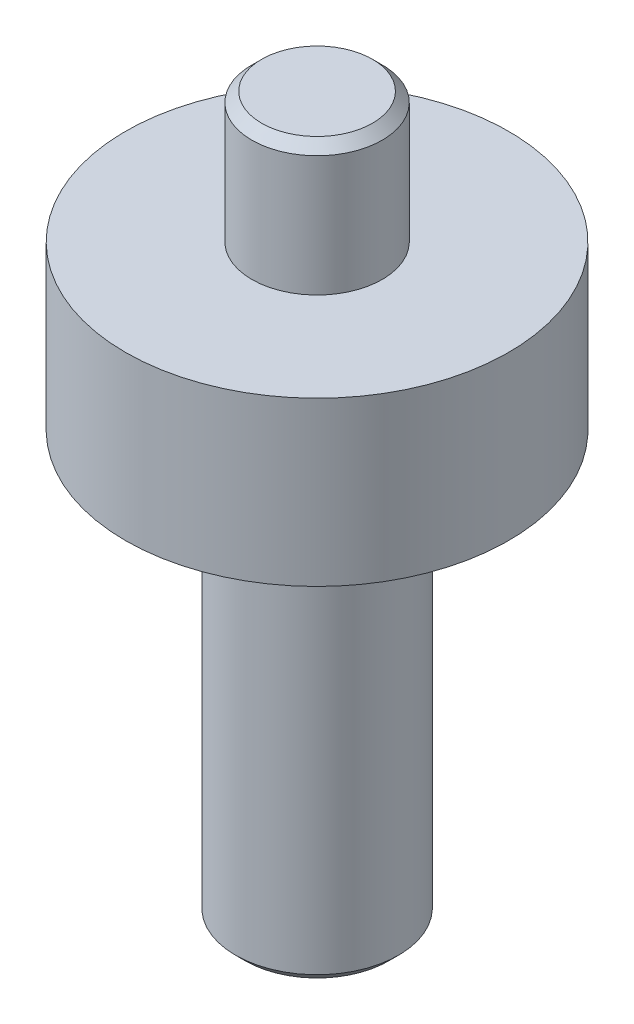
ISO-10303-21;
HEADER;
FILE_DESCRIPTION(('STEP AP214'),'2;1');
FILE_NAME('part.step','',(''),(''),'','','');
FILE_SCHEMA(('AUTOMOTIVE_DESIGN { 1 0 10303 214 1 1 1 1 }'));
ENDSEC;
DATA;
#1=APPLICATION_CONTEXT('core data for automotive mechanical design processes');
#2=APPLICATION_PROTOCOL_DEFINITION('international standard','automotive_design',2000,#1);
#3=PRODUCT_CONTEXT('',#1,'mechanical');
#4=PRODUCT('Part','Part','',(#3));
#5=PRODUCT_RELATED_PRODUCT_CATEGORY('part','',(#4));
#6=PRODUCT_DEFINITION_FORMATION('','',#4);
#7=PRODUCT_DEFINITION_CONTEXT('part definition',#1,'design');
#8=PRODUCT_DEFINITION('design','',#6,#7);
#9=PRODUCT_DEFINITION_SHAPE('','',#8);
#10=(LENGTH_UNIT() NAMED_UNIT(*) SI_UNIT(.MILLI.,.METRE.));
#11=(NAMED_UNIT(*) PLANE_ANGLE_UNIT() SI_UNIT($,.RADIAN.));
#12=(NAMED_UNIT(*) SI_UNIT($,.STERADIAN.) SOLID_ANGLE_UNIT());
#13=UNCERTAINTY_MEASURE_WITH_UNIT(LENGTH_MEASURE(1.E-05),#10,'distance_accuracy_value','');
#14=(GEOMETRIC_REPRESENTATION_CONTEXT(3) GLOBAL_UNCERTAINTY_ASSIGNED_CONTEXT((#13)) GLOBAL_UNIT_ASSIGNED_CONTEXT((#10,
#11,#12)) REPRESENTATION_CONTEXT('',''));
#15=CARTESIAN_POINT('',(0.,0.,0.));
#16=DIRECTION('',(0.,0.,1.));
#17=DIRECTION('',(1.,0.,0.));
#18=AXIS2_PLACEMENT_3D('',#15,#16,#17);
#19=CARTESIAN_POINT('',(0.,10.,0.));
#20=DIRECTION('',(0.,-1.,0.));
#21=DIRECTION('',(0.,0.,-1.));
#22=AXIS2_PLACEMENT_3D('',#19,#20,#21);
#23=CYLINDRICAL_SURFACE('',#22,11.75);
#24=CARTESIAN_POINT('',(0.,10.,0.));
#25=DIRECTION('',(0.,1.,0.));
#26=DIRECTION('',(0.,0.,1.));
#27=AXIS2_PLACEMENT_3D('',#24,#25,#26);
#28=CIRCLE('',#27,11.75);
#29=CARTESIAN_POINT('',(0.,10.,11.75));
#30=VERTEX_POINT('',#29);
#31=EDGE_CURVE('E128',#30,#30,#28,.T.);
#32=ORIENTED_EDGE('',*,*,#31,.F.);
#33=EDGE_LOOP('',(#32));
#34=FACE_BOUND('',#33,.T.);
#35=CARTESIAN_POINT('',(0.,0.,0.));
#36=DIRECTION('',(0.,1.,0.));
#37=DIRECTION('',(0.,0.,1.));
#38=AXIS2_PLACEMENT_3D('',#35,#36,#37);
#39=CIRCLE('',#38,11.75);
#40=CARTESIAN_POINT('',(0.,0.,11.75));
#41=VERTEX_POINT('',#40);
#42=EDGE_CURVE('E124',#41,#41,#39,.T.);
#43=ORIENTED_EDGE('',*,*,#42,.T.);
#44=EDGE_LOOP('',(#43));
#45=FACE_BOUND('',#44,.T.);
#46=ADVANCED_FACE('F43',(#34,#45),#23,.T.);
#47=CARTESIAN_POINT('',(0.,10.,0.));
#48=DIRECTION('',(0.,1.,0.));
#49=DIRECTION('',(0.,0.,1.));
#50=AXIS2_PLACEMENT_3D('',#47,#48,#49);
#51=PLANE('',#50);
#52=CARTESIAN_POINT('',(0.,10.,0.));
#53=DIRECTION('',(0.,1.,0.));
#54=DIRECTION('',(0.,0.,1.));
#55=AXIS2_PLACEMENT_3D('',#52,#53,#54);
#56=CIRCLE('',#55,4.);
#57=CARTESIAN_POINT('',(0.,10.,4.));
#58=VERTEX_POINT('',#57);
#59=EDGE_CURVE('E116',#58,#58,#56,.T.);
#60=ORIENTED_EDGE('',*,*,#59,.F.);
#61=EDGE_LOOP('',(#60));
#62=FACE_BOUND('',#61,.T.);
#63=ORIENTED_EDGE('',*,*,#31,.T.);
#64=EDGE_LOOP('',(#63));
#65=FACE_BOUND('',#64,.T.);
#66=ADVANCED_FACE('F188',(#62,#65),#51,.T.);
#67=CARTESIAN_POINT('',(0.,0.,0.));
#68=DIRECTION('',(0.,1.,0.));
#69=DIRECTION('',(0.,0.,1.));
#70=AXIS2_PLACEMENT_3D('',#67,#68,#69);
#71=PLANE('',#70);
#72=CARTESIAN_POINT('',(0.,0.,0.));
#73=DIRECTION('',(0.,1.,0.));
#74=DIRECTION('',(0.,0.,1.));
#75=AXIS2_PLACEMENT_3D('',#72,#73,#74);
#76=CIRCLE('',#75,6.);
#77=CARTESIAN_POINT('',(0.,0.,6.));
#78=VERTEX_POINT('',#77);
#79=EDGE_CURVE('E125',#78,#78,#76,.T.);
#80=ORIENTED_EDGE('',*,*,#79,.T.);
#81=EDGE_LOOP('',(#80));
#82=FACE_BOUND('',#81,.T.);
#83=ORIENTED_EDGE('',*,*,#42,.F.);
#84=EDGE_LOOP('',(#83));
#85=FACE_BOUND('',#84,.T.);
#86=ADVANCED_FACE('F195',(#82,#85),#71,.F.);
#87=CARTESIAN_POINT('',(0.,-4.,0.));
#88=DIRECTION('',(0.,1.,0.));
#89=DIRECTION('',(0.,0.,1.));
#90=AXIS2_PLACEMENT_3D('',#87,#88,#89);
#91=CYLINDRICAL_SURFACE('',#90,6.);
#92=CARTESIAN_POINT('',(0.,-4.,0.));
#93=DIRECTION('',(0.,1.,0.));
#94=DIRECTION('',(0.,0.,1.));
#95=AXIS2_PLACEMENT_3D('',#92,#93,#94);
#96=CIRCLE('',#95,6.);
#97=CARTESIAN_POINT('',(0.,-4.,6.));
#98=VERTEX_POINT('',#97);
#99=EDGE_CURVE('E121',#98,#98,#96,.T.);
#100=ORIENTED_EDGE('',*,*,#99,.T.);
#101=EDGE_LOOP('',(#100));
#102=FACE_BOUND('',#101,.T.);
#103=ORIENTED_EDGE('',*,*,#79,.F.);
#104=EDGE_LOOP('',(#103));
#105=FACE_BOUND('',#104,.T.);
#106=ADVANCED_FACE('F201',(#102,#105),#91,.T.);
#107=CARTESIAN_POINT('',(0.,-4.,0.));
#108=DIRECTION('',(0.,1.,0.));
#109=DIRECTION('',(0.,0.,1.));
#110=AXIS2_PLACEMENT_3D('',#107,#108,#109);
#111=PLANE('',#110);
#112=CARTESIAN_POINT('',(0.,-4.,0.));
#113=DIRECTION('',(0.,1.,0.));
#114=DIRECTION('',(0.,0.,1.));
#115=AXIS2_PLACEMENT_3D('',#112,#113,#114);
#116=CIRCLE('',#115,5.);
#117=CARTESIAN_POINT('',(0.,-4.,5.));
#118=VERTEX_POINT('',#117);
#119=EDGE_CURVE('E112',#118,#118,#116,.T.);
#120=ORIENTED_EDGE('',*,*,#119,.T.);
#121=EDGE_LOOP('',(#120));
#122=FACE_BOUND('',#121,.T.);
#123=ORIENTED_EDGE('',*,*,#99,.F.);
#124=EDGE_LOOP('',(#123));
#125=FACE_BOUND('',#124,.T.);
#126=ADVANCED_FACE('F185',(#122,#125),#111,.F.);
#127=CARTESIAN_POINT('',(0.,-26.,0.));
#128=DIRECTION('',(0.,1.,0.));
#129=DIRECTION('',(0.,0.,1.));
#130=AXIS2_PLACEMENT_3D('',#127,#128,#129);
#131=CYLINDRICAL_SURFACE('',#130,5.);
#132=CARTESIAN_POINT('',(-4.58257569495584,-22.2,-2.));
#133=CARTESIAN_POINT('',(-4.58256464470381,-22.2538058525026,-2.00000798036348));
#134=CARTESIAN_POINT('',(-4.58352306077323,-22.3076056655576,-1.99782891366025));
#135=CARTESIAN_POINT('',(-4.58729625417543,-22.4147712982547,-1.98915905973447));
#136=CARTESIAN_POINT('',(-4.59011032448545,-22.468137275356,-1.98266991468793));
#137=CARTESIAN_POINT('',(-4.59749782920639,-22.5738468215588,-1.9654760367637));
#138=CARTESIAN_POINT('',(-4.60206430717533,-22.626193584044,-1.95478796820434));
#139=CARTESIAN_POINT('',(-4.61280053296682,-22.7297007717145,-1.92931630190661));
#140=CARTESIAN_POINT('',(-4.61897037865398,-22.7808611242772,-1.91453245417091));
#141=CARTESIAN_POINT('',(-4.63959291248421,-22.931935850582,-1.86426971793523));
#142=CARTESIAN_POINT('',(-4.6561744915743,-23.0296542306897,-1.82284489460008));
#143=CARTESIAN_POINT('',(-4.6931237076538,-23.2167955800826,-1.72548191592176));
#144=CARTESIAN_POINT('',(-4.71349493864007,-23.3062105529617,-1.66952996336926));
#145=CARTESIAN_POINT('',(-4.75700999402114,-23.4792623966742,-1.54131835736855));
#146=CARTESIAN_POINT('',(-4.78024245635516,-23.5623672169202,-1.4683691399273));
#147=CARTESIAN_POINT('',(-4.82612790548656,-23.7155402722107,-1.30969646176209));
#148=CARTESIAN_POINT('',(-4.84878077249721,-23.7856058308657,-1.22397038499682));
#149=CARTESIAN_POINT('',(-4.89203417106082,-23.9134063941956,-1.03800590808969));
#150=CARTESIAN_POINT('',(-4.91251824543531,-23.9705448092619,-0.937327933050964));
#151=CARTESIAN_POINT('',(-4.94803944125004,-24.0668440726886,-0.726824143246712));
#152=CARTESIAN_POINT('',(-4.96307883544185,-24.1060124240517,-0.617002169026247));
#153=CARTESIAN_POINT('',(-4.98538314653816,-24.1633412013106,-0.396967441295693));
#154=CARTESIAN_POINT('',(-4.99298922547927,-24.1824269509057,-0.287031054523062));
#155=CARTESIAN_POINT('',(-5.00080310201086,-24.2020284799456,-0.0652684304565176));
#156=CARTESIAN_POINT('',(-5.0010135205303,-24.2025508380235,0.0465571232841632));
#157=CARTESIAN_POINT('',(-4.99421960045302,-24.1855171608401,0.262233376226782));
#158=CARTESIAN_POINT('',(-4.98761985585461,-24.168974953326,0.366179202506789));
#159=CARTESIAN_POINT('',(-4.96849270441446,-24.1200065729465,0.569674786500927));
#160=CARTESIAN_POINT('',(-4.95596496209929,-24.0875795011314,0.66922429507284));
#161=CARTESIAN_POINT('',(-4.92596830598785,-24.0073637035755,0.862897539070294));
#162=CARTESIAN_POINT('',(-4.90842774755848,-23.9593507591895,0.956916851366438));
#163=CARTESIAN_POINT('',(-4.87014602008043,-23.8495354114048,1.13580746919776));
#164=CARTESIAN_POINT('',(-4.84940372896448,-23.7877281703094,1.22067554984697));
#165=CARTESIAN_POINT('',(-4.80521782746144,-23.6473558197415,1.38476339273626));
#166=CARTESIAN_POINT('',(-4.78168627172884,-23.56795752533,1.46324770308939));
#167=CARTESIAN_POINT('',(-4.7356195058465,-23.3970199048523,1.60609926099478));
#168=CARTESIAN_POINT('',(-4.71308475332783,-23.3054750779057,1.67046007709005));
#169=CARTESIAN_POINT('',(-4.67095688856025,-23.1095297159788,1.78493657933605));
#170=CARTESIAN_POINT('',(-4.65146702150583,-23.0048351633398,1.83458932217622));
#171=CARTESIAN_POINT('',(-4.61886105059582,-22.7876384755705,1.91521298357264));
#172=CARTESIAN_POINT('',(-4.60573367628738,-22.6751505526617,1.94621696002208));
#173=CARTESIAN_POINT('',(-4.59208303529493,-22.501256365842,1.9781058182572));
#174=CARTESIAN_POINT('',(-4.58853437680526,-22.4413424506987,1.98630505165979));
#175=CARTESIAN_POINT('',(-4.58377540314389,-22.3209649810045,1.99725282103811));
#176=CARTESIAN_POINT('',(-4.58256364711745,-22.2605017882422,2.00000471568568));
#177=CARTESIAN_POINT('',(-4.58257569495584,-22.2,2.));
#178=B_SPLINE_CURVE_WITH_KNOTS('',3,(#132,#133,#134,#135,#136,#137,#138,#139,#140,#141,#142,
#143,#144,#145,#146,#147,#148,#149,#150,#151,#152,#153,#154,#155,#156,#157,#158,#159,#160,#161,
#162,#163,#164,#165,#166,#167,#168,#169,#170,#171,#172,#173,#174,#175,#176,#177),.UNSPECIFIED.,
.F.,.F.,(4,2,2,2,2,2,2,2,2,2,2,2,2,2,2,2,2,2,2,2,2,2,4),(0.,0.161354853098821,0.322648263883208,
0.48330791125188,0.643977367092306,0.964683001739097,1.28569434942626,1.62318047995498,
1.96073580539191,2.31162858925764,2.66237473197323,2.9961387650427,3.32978451514656,
3.64468915259535,3.95961161305654,4.27928176927547,4.59906421133019,4.93981874675153,
5.28072813203934,5.63144241548463,5.98153315592125,6.16300192557814,6.34435877193561),.UNSPECIFIED.);
#179=CARTESIAN_POINT('',(-4.58257569495584,-22.2,-2.));
#180=VERTEX_POINT('',#179);
#181=CARTESIAN_POINT('',(-4.58257569495584,-22.2,2.));
#182=VERTEX_POINT('',#181);
#183=EDGE_CURVE('E11',#180,#182,#178,.T.);
#184=ORIENTED_EDGE('',*,*,#183,.F.);
#185=DIRECTION('',(0.,1.,0.));
#186=VECTOR('',#185,1.);
#187=CARTESIAN_POINT('',(-4.58257569495584,-26.,-2.));
#188=LINE('',#187,#186);
#189=CARTESIAN_POINT('',(-4.58257569495584,-7.2,-2.));
#190=VERTEX_POINT('',#189);
#191=EDGE_CURVE('E91',#190,#180,#188,.F.);
#192=ORIENTED_EDGE('',*,*,#191,.F.);
#193=CARTESIAN_POINT('',(-4.58257569495584,-7.19999999999999,2.));
#194=CARTESIAN_POINT('',(-4.58256464470381,-7.1461941474974,2.00000798036348));
#195=CARTESIAN_POINT('',(-4.58352306077323,-7.09239433444235,1.99782891366025));
#196=CARTESIAN_POINT('',(-4.58729625417543,-6.98522870174529,1.98915905973447));
#197=CARTESIAN_POINT('',(-4.59011032448545,-6.93186272464397,1.98266991468793));
#198=CARTESIAN_POINT('',(-4.59749782920639,-6.82615317844121,1.9654760367637));
#199=CARTESIAN_POINT('',(-4.60206430717533,-6.77380641595597,1.95478796820434));
#200=CARTESIAN_POINT('',(-4.61280053296682,-6.67029922828554,1.92931630190661));
#201=CARTESIAN_POINT('',(-4.61897037865398,-6.61913887572283,1.91453245417091));
#202=CARTESIAN_POINT('',(-4.63959291248421,-6.46806414941803,1.86426971793523));
#203=CARTESIAN_POINT('',(-4.6561744915743,-6.37034576931025,1.82284489460008));
#204=CARTESIAN_POINT('',(-4.6931237076538,-6.18320441991736,1.72548191592176));
#205=CARTESIAN_POINT('',(-4.71349493864007,-6.09378944703834,1.66952996336926));
#206=CARTESIAN_POINT('',(-4.75700999402114,-5.92073760332578,1.54131835736855));
#207=CARTESIAN_POINT('',(-4.78024245635516,-5.83763278307977,1.4683691399273));
#208=CARTESIAN_POINT('',(-4.82612790548656,-5.68445972778927,1.30969646176209));
#209=CARTESIAN_POINT('',(-4.84878077249721,-5.61439416913425,1.22397038499682));
#210=CARTESIAN_POINT('',(-4.89203417106082,-5.48659360580435,1.03800590808969));
#211=CARTESIAN_POINT('',(-4.91251824543531,-5.42945519073807,0.937327933050964));
#212=CARTESIAN_POINT('',(-4.94803944125004,-5.33315592731135,0.726824143246712));
#213=CARTESIAN_POINT('',(-4.96307883544185,-5.29398757594832,0.617002169026247));
#214=CARTESIAN_POINT('',(-4.98538314653816,-5.23665879868942,0.396967441295694));
#215=CARTESIAN_POINT('',(-4.99298922547927,-5.21757304909434,0.287031054523063));
#216=CARTESIAN_POINT('',(-5.00080310201086,-5.19797152005438,0.0652684304565189));
#217=CARTESIAN_POINT('',(-5.0010135205303,-5.19744916197646,-0.0465571232841614));
#218=CARTESIAN_POINT('',(-4.99421960045302,-5.21448283915986,-0.26223337622678));
#219=CARTESIAN_POINT('',(-4.98761985585461,-5.231025046674,-0.366179202506787));
#220=CARTESIAN_POINT('',(-4.96849270441446,-5.27999342705353,-0.569674786500925));
#221=CARTESIAN_POINT('',(-4.95596496209929,-5.31242049886861,-0.669224295072838));
#222=CARTESIAN_POINT('',(-4.92596830598785,-5.39263629642451,-0.862897539070291));
#223=CARTESIAN_POINT('',(-4.90842774755848,-5.44064924081045,-0.956916851366435));
#224=CARTESIAN_POINT('',(-4.87014602008043,-5.55046458859515,-1.13580746919776));
#225=CARTESIAN_POINT('',(-4.84940372896449,-5.61227182969058,-1.22067554984697));
#226=CARTESIAN_POINT('',(-4.80521782746144,-5.75264418025851,-1.38476339273626));
#227=CARTESIAN_POINT('',(-4.78168627172885,-5.83204247467003,-1.46324770308939));
#228=CARTESIAN_POINT('',(-4.7356195058465,-6.00298009514766,-1.60609926099477));
#229=CARTESIAN_POINT('',(-4.71308475332783,-6.09452492209426,-1.67046007709005));
#230=CARTESIAN_POINT('',(-4.67095688856025,-6.29047028402121,-1.78493657933605));
#231=CARTESIAN_POINT('',(-4.65146702150583,-6.3951648366602,-1.83458932217622));
#232=CARTESIAN_POINT('',(-4.61886105059582,-6.61236152442947,-1.91521298357264));
#233=CARTESIAN_POINT('',(-4.60573367628738,-6.72484944733829,-1.94621696002207));
#234=CARTESIAN_POINT('',(-4.59208303529493,-6.89874363415798,-1.97810581825719));
#235=CARTESIAN_POINT('',(-4.58853437680527,-6.95865754930133,-1.98630505165979));
#236=CARTESIAN_POINT('',(-4.58377540314389,-7.07903501899553,-1.99725282103811));
#237=CARTESIAN_POINT('',(-4.58256364711745,-7.13949821175782,-2.00000471568567));
#238=CARTESIAN_POINT('',(-4.58257569495584,-7.2,-1.99999999999999));
#239=B_SPLINE_CURVE_WITH_KNOTS('',3,(#193,#194,#195,#196,#197,#198,#199,#200,#201,#202,#203,
#204,#205,#206,#207,#208,#209,#210,#211,#212,#213,#214,#215,#216,#217,#218,#219,#220,#221,#222,
#223,#224,#225,#226,#227,#228,#229,#230,#231,#232,#233,#234,#235,#236,#237,#238),.UNSPECIFIED.,
.F.,.F.,(4,2,2,2,2,2,2,2,2,2,2,2,2,2,2,2,2,2,2,2,2,2,4),(0.,0.161354853098824,0.322648263883208,
0.483307911251881,0.643977367092304,0.964683001739092,1.28569434942625,1.62318047995498,
1.96073580539191,2.31162858925763,2.66237473197322,2.99613876504269,3.32978451514655,
3.64468915259534,3.95961161305654,4.27928176927546,4.59906421133018,4.93981874675152,
5.28072813203933,5.63144241548462,5.98153315592124,6.16300192557812,6.3443587719356),.UNSPECIFIED.);
#240=CARTESIAN_POINT('',(-4.58257569495584,-7.19999999999999,2.));
#241=VERTEX_POINT('',#240);
#242=EDGE_CURVE('E146',#241,#190,#239,.T.);
#243=ORIENTED_EDGE('',*,*,#242,.F.);
#244=DIRECTION('',(0.,1.,0.));
#245=VECTOR('',#244,1.);
#246=CARTESIAN_POINT('',(-4.58257569495584,-26.,2.));
#247=LINE('',#246,#245);
#248=EDGE_CURVE('E57',#182,#241,#247,.T.);
#249=ORIENTED_EDGE('',*,*,#248,.F.);
#250=EDGE_LOOP('',(#184,#192,#243,#249));
#251=FACE_BOUND('',#250,.T.);
#252=CARTESIAN_POINT('',(0.,-25.4,0.));
#253=DIRECTION('',(0.,1.,0.));
#254=DIRECTION('',(0.,0.,1.));
#255=AXIS2_PLACEMENT_3D('',#252,#253,#254);
#256=CIRCLE('',#255,5.);
#257=CARTESIAN_POINT('',(0.,-25.4,5.));
#258=VERTEX_POINT('',#257);
#259=EDGE_CURVE('E131',#258,#258,#256,.T.);
#260=ORIENTED_EDGE('',*,*,#259,.T.);
#261=EDGE_LOOP('',(#260));
#262=FACE_BOUND('',#261,.T.);
#263=ORIENTED_EDGE('',*,*,#119,.F.);
#264=EDGE_LOOP('',(#263));
#265=FACE_BOUND('',#264,.T.);
#266=ADVANCED_FACE('F152',(#251,#262,#265),#131,.T.);
#267=CARTESIAN_POINT('',(0.,-26.,0.));
#268=DIRECTION('',(0.,1.,0.));
#269=DIRECTION('',(0.,0.,1.));
#270=AXIS2_PLACEMENT_3D('',#267,#268,#269);
#271=PLANE('',#270);
#272=CARTESIAN_POINT('',(0.,-26.,0.));
#273=DIRECTION('',(0.,1.,0.));
#274=DIRECTION('',(0.,0.,1.));
#275=AXIS2_PLACEMENT_3D('',#272,#273,#274);
#276=CIRCLE('',#275,4.39999999999998);
#277=CARTESIAN_POINT('',(0.,-26.,4.39999999999998));
#278=VERTEX_POINT('',#277);
#279=EDGE_CURVE('E120',#278,#278,#276,.F.);
#280=ORIENTED_EDGE('',*,*,#279,.T.);
#281=EDGE_LOOP('',(#280));
#282=FACE_BOUND('',#281,.T.);
#283=ADVANCED_FACE('F176',(#282),#271,.F.);
#284=CARTESIAN_POINT('',(0.,-25.4,0.));
#285=DIRECTION('',(0.,1.,0.));
#286=DIRECTION('',(0.,0.,1.));
#287=AXIS2_PLACEMENT_3D('',#284,#285,#286);
#288=CONICAL_SURFACE('',#287,5.,0.785398163397451);
#289=ORIENTED_EDGE('',*,*,#279,.F.);
#290=EDGE_LOOP('',(#289));
#291=FACE_BOUND('',#290,.T.);
#292=ORIENTED_EDGE('',*,*,#259,.F.);
#293=EDGE_LOOP('',(#292));
#294=FACE_BOUND('',#293,.T.);
#295=ADVANCED_FACE('F174',(#291,#294),#288,.T.);
#296=CARTESIAN_POINT('',(0.,18.,0.));
#297=DIRECTION('',(0.,-1.,0.));
#298=DIRECTION('',(0.,0.,-1.));
#299=AXIS2_PLACEMENT_3D('',#296,#297,#298);
#300=CYLINDRICAL_SURFACE('',#299,4.);
#301=CARTESIAN_POINT('',(0.,17.4,0.));
#302=DIRECTION('',(0.,1.,0.));
#303=DIRECTION('',(0.,0.,1.));
#304=AXIS2_PLACEMENT_3D('',#301,#302,#303);
#305=CIRCLE('',#304,4.);
#306=CARTESIAN_POINT('',(0.,17.4,4.));
#307=VERTEX_POINT('',#306);
#308=EDGE_CURVE('E142',#307,#307,#305,.F.);
#309=ORIENTED_EDGE('',*,*,#308,.T.);
#310=EDGE_LOOP('',(#309));
#311=FACE_BOUND('',#310,.T.);
#312=ORIENTED_EDGE('',*,*,#59,.T.);
#313=EDGE_LOOP('',(#312));
#314=FACE_BOUND('',#313,.T.);
#315=ADVANCED_FACE('F171',(#311,#314),#300,.T.);
#316=CARTESIAN_POINT('',(0.,18.,0.));
#317=DIRECTION('',(0.,1.,0.));
#318=DIRECTION('',(0.,0.,1.));
#319=AXIS2_PLACEMENT_3D('',#316,#317,#318);
#320=PLANE('',#319);
#321=CARTESIAN_POINT('',(0.,18.,0.));
#322=DIRECTION('',(0.,1.,0.));
#323=DIRECTION('',(0.,0.,1.));
#324=AXIS2_PLACEMENT_3D('',#321,#322,#323);
#325=CIRCLE('',#324,3.4);
#326=CARTESIAN_POINT('',(0.,18.,3.4));
#327=VERTEX_POINT('',#326);
#328=EDGE_CURVE('E119',#327,#327,#325,.T.);
#329=ORIENTED_EDGE('',*,*,#328,.T.);
#330=EDGE_LOOP('',(#329));
#331=FACE_BOUND('',#330,.T.);
#332=ADVANCED_FACE('F168',(#331),#320,.T.);
#333=CARTESIAN_POINT('',(0.,18.,0.));
#334=DIRECTION('',(0.,-1.,0.));
#335=DIRECTION('',(0.,0.,-1.));
#336=AXIS2_PLACEMENT_3D('',#333,#334,#335);
#337=CONICAL_SURFACE('',#336,3.4,0.785398163397448);
#338=ORIENTED_EDGE('',*,*,#308,.F.);
#339=EDGE_LOOP('',(#338));
#340=FACE_BOUND('',#339,.T.);
#341=ORIENTED_EDGE('',*,*,#328,.F.);
#342=EDGE_LOOP('',(#341));
#343=FACE_BOUND('',#342,.T.);
#344=ADVANCED_FACE('F45',(#340,#343),#337,.T.);
#345=CARTESIAN_POINT('',(-13.5,-22.2,0.));
#346=DIRECTION('',(1.,0.,0.));
#347=DIRECTION('',(0.,0.,-1.));
#348=AXIS2_PLACEMENT_3D('',#345,#346,#347);
#349=CYLINDRICAL_SURFACE('',#348,2.);
#350=ORIENTED_EDGE('',*,*,#183,.T.);
#351=DIRECTION('',(1.,0.,0.));
#352=VECTOR('',#351,1.);
#353=CARTESIAN_POINT('',(-13.5,-22.2,2.));
#354=LINE('',#353,#352);
#355=CARTESIAN_POINT('',(-3.5,-22.2,2.));
#356=VERTEX_POINT('',#355);
#357=EDGE_CURVE('E106',#182,#356,#354,.T.);
#358=ORIENTED_EDGE('',*,*,#357,.T.);
#359=CARTESIAN_POINT('',(-3.5,-22.2,0.));
#360=DIRECTION('',(1.,0.,0.));
#361=DIRECTION('',(0.,0.,-1.));
#362=AXIS2_PLACEMENT_3D('',#359,#360,#361);
#363=CIRCLE('',#362,2.);
#364=CARTESIAN_POINT('',(-3.5,-22.2,-2.));
#365=VERTEX_POINT('',#364);
#366=EDGE_CURVE('E100',#356,#365,#363,.T.);
#367=ORIENTED_EDGE('',*,*,#366,.T.);
#368=DIRECTION('',(1.,0.,0.));
#369=VECTOR('',#368,1.);
#370=CARTESIAN_POINT('',(-13.5,-22.2,-2.));
#371=LINE('',#370,#369);
#372=EDGE_CURVE('E86',#180,#365,#371,.T.);
#373=ORIENTED_EDGE('',*,*,#372,.F.);
#374=EDGE_LOOP('',(#350,#358,#367,#373));
#375=FACE_BOUND('',#374,.T.);
#376=ADVANCED_FACE('F105',(#375),#349,.F.);
#377=CARTESIAN_POINT('',(-13.5,-22.2,2.));
#378=DIRECTION('',(0.,0.,1.));
#379=DIRECTION('',(1.,0.,0.));
#380=AXIS2_PLACEMENT_3D('',#377,#378,#379);
#381=PLANE('',#380);
#382=ORIENTED_EDGE('',*,*,#248,.T.);
#383=DIRECTION('',(1.,0.,0.));
#384=VECTOR('',#383,1.);
#385=CARTESIAN_POINT('',(-13.5,-7.19999999999999,2.));
#386=LINE('',#385,#384);
#387=CARTESIAN_POINT('',(-3.5,-7.19999999999999,2.));
#388=VERTEX_POINT('',#387);
#389=EDGE_CURVE('E113',#241,#388,#386,.T.);
#390=ORIENTED_EDGE('',*,*,#389,.T.);
#391=DIRECTION('',(0.,-1.,0.));
#392=VECTOR('',#391,1.);
#393=CARTESIAN_POINT('',(-3.5,-22.2,2.));
#394=LINE('',#393,#392);
#395=EDGE_CURVE('E93',#388,#356,#394,.T.);
#396=ORIENTED_EDGE('',*,*,#395,.T.);
#397=ORIENTED_EDGE('',*,*,#357,.F.);
#398=EDGE_LOOP('',(#382,#390,#396,#397));
#399=FACE_BOUND('',#398,.T.);
#400=ADVANCED_FACE('F161',(#399),#381,.F.);
#401=CARTESIAN_POINT('',(-13.5,-7.2,0.));
#402=DIRECTION('',(1.,0.,0.));
#403=DIRECTION('',(0.,0.,-1.));
#404=AXIS2_PLACEMENT_3D('',#401,#402,#403);
#405=CYLINDRICAL_SURFACE('',#404,2.);
#406=ORIENTED_EDGE('',*,*,#242,.T.);
#407=DIRECTION('',(1.,0.,0.));
#408=VECTOR('',#407,1.);
#409=CARTESIAN_POINT('',(-13.5,-7.2,-1.99999999999999));
#410=LINE('',#409,#408);
#411=CARTESIAN_POINT('',(-3.5,-7.2,-1.99999999999999));
#412=VERTEX_POINT('',#411);
#413=EDGE_CURVE('E64',#190,#412,#410,.T.);
#414=ORIENTED_EDGE('',*,*,#413,.T.);
#415=CARTESIAN_POINT('',(-3.5,-7.2,0.));
#416=DIRECTION('',(1.,0.,0.));
#417=DIRECTION('',(0.,0.,-1.));
#418=AXIS2_PLACEMENT_3D('',#415,#416,#417);
#419=CIRCLE('',#418,2.);
#420=EDGE_CURVE('E103',#412,#388,#419,.T.);
#421=ORIENTED_EDGE('',*,*,#420,.T.);
#422=ORIENTED_EDGE('',*,*,#389,.F.);
#423=EDGE_LOOP('',(#406,#414,#421,#422));
#424=FACE_BOUND('',#423,.T.);
#425=ADVANCED_FACE('F156',(#424),#405,.F.);
#426=CARTESIAN_POINT('',(-13.5,-22.2,-2.));
#427=DIRECTION('',(0.,0.,-1.));
#428=DIRECTION('',(0.,1.,0.));
#429=AXIS2_PLACEMENT_3D('',#426,#427,#428);
#430=PLANE('',#429);
#431=ORIENTED_EDGE('',*,*,#191,.T.);
#432=ORIENTED_EDGE('',*,*,#372,.T.);
#433=DIRECTION('',(0.,1.,0.));
#434=VECTOR('',#433,1.);
#435=CARTESIAN_POINT('',(-3.5,-22.2,-2.));
#436=LINE('',#435,#434);
#437=EDGE_CURVE('E89',#365,#412,#436,.T.);
#438=ORIENTED_EDGE('',*,*,#437,.T.);
#439=ORIENTED_EDGE('',*,*,#413,.F.);
#440=EDGE_LOOP('',(#431,#432,#438,#439));
#441=FACE_BOUND('',#440,.T.);
#442=ADVANCED_FACE('F88',(#441),#430,.F.);
#443=CARTESIAN_POINT('',(-3.5,-22.2,0.));
#444=DIRECTION('',(1.,0.,0.));
#445=DIRECTION('',(0.,0.,-1.));
#446=AXIS2_PLACEMENT_3D('',#443,#444,#445);
#447=PLANE('',#446);
#448=ORIENTED_EDGE('',*,*,#366,.F.);
#449=ORIENTED_EDGE('',*,*,#395,.F.);
#450=ORIENTED_EDGE('',*,*,#420,.F.);
#451=ORIENTED_EDGE('',*,*,#437,.F.);
#452=EDGE_LOOP('',(#448,#449,#450,#451));
#453=FACE_BOUND('',#452,.T.);
#454=ADVANCED_FACE('F98',(#453),#447,.F.);
#455=CLOSED_SHELL('',(#46,#66,#86,#106,#126,#266,#283,#295,#315,#332,#344,#376,#400,#425,#442,#454));
#456=MANIFOLD_SOLID_BREP('B2',#455);
#457=ADVANCED_BREP_SHAPE_REPRESENTATION('',(#18,#456),#14);
#458=SHAPE_DEFINITION_REPRESENTATION(#9,#457);
ENDSEC;
END-ISO-10303-21;
